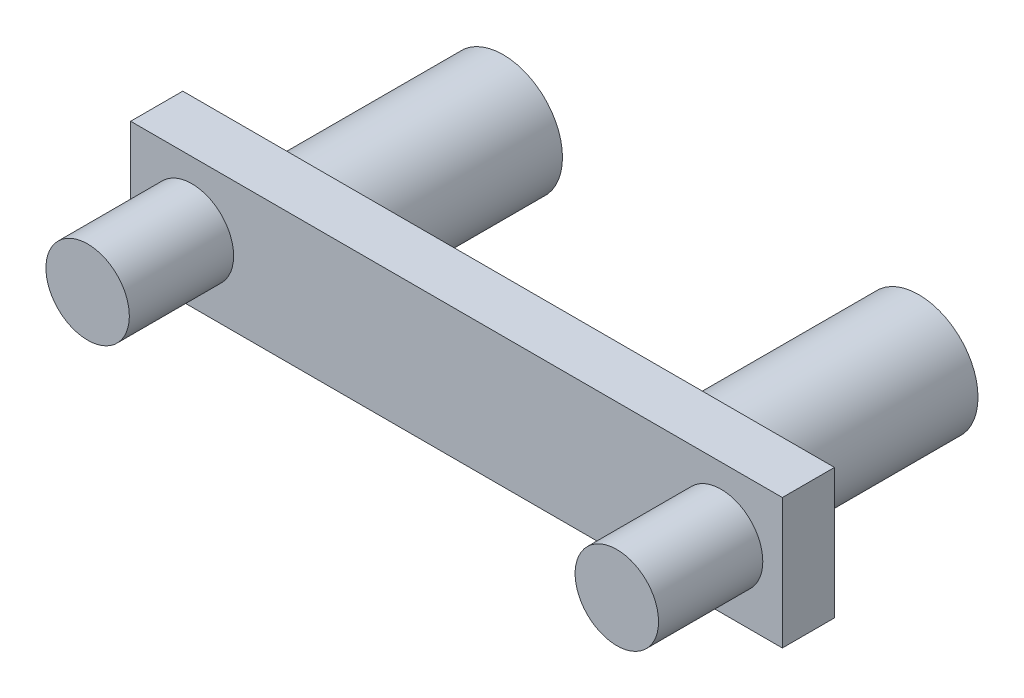
ISO-10303-21;
HEADER;
FILE_DESCRIPTION(('STEP AP214'),'2;1');
FILE_NAME('part.step','',(''),(''),'','','');
FILE_SCHEMA(('AUTOMOTIVE_DESIGN { 1 0 10303 214 1 1 1 1 }'));
ENDSEC;
DATA;
#1=APPLICATION_CONTEXT('core data for automotive mechanical design processes');
#2=APPLICATION_PROTOCOL_DEFINITION('international standard','automotive_design',2000,#1);
#3=PRODUCT_CONTEXT('',#1,'mechanical');
#4=PRODUCT('Part','Part','',(#3));
#5=PRODUCT_RELATED_PRODUCT_CATEGORY('part','',(#4));
#6=PRODUCT_DEFINITION_FORMATION('','',#4);
#7=PRODUCT_DEFINITION_CONTEXT('part definition',#1,'design');
#8=PRODUCT_DEFINITION('design','',#6,#7);
#9=PRODUCT_DEFINITION_SHAPE('','',#8);
#10=(LENGTH_UNIT() NAMED_UNIT(*) SI_UNIT(.MILLI.,.METRE.));
#11=(NAMED_UNIT(*) PLANE_ANGLE_UNIT() SI_UNIT($,.RADIAN.));
#12=(NAMED_UNIT(*) SI_UNIT($,.STERADIAN.) SOLID_ANGLE_UNIT());
#13=UNCERTAINTY_MEASURE_WITH_UNIT(LENGTH_MEASURE(1.E-05),#10,'distance_accuracy_value','');
#14=(GEOMETRIC_REPRESENTATION_CONTEXT(3) GLOBAL_UNCERTAINTY_ASSIGNED_CONTEXT((#13)) GLOBAL_UNIT_ASSIGNED_CONTEXT((#10,
#11,#12)) REPRESENTATION_CONTEXT('',''));
#15=CARTESIAN_POINT('',(0.,0.,0.));
#16=DIRECTION('',(0.,0.,1.));
#17=DIRECTION('',(1.,0.,0.));
#18=AXIS2_PLACEMENT_3D('',#15,#16,#17);
#19=CARTESIAN_POINT('',(0.,5.,2.));
#20=DIRECTION('',(1.,0.,0.));
#21=DIRECTION('',(0.,1.,0.));
#22=AXIS2_PLACEMENT_3D('',#19,#20,#21);
#23=PLANE('',#22);
#24=DIRECTION('',(0.,-1.,0.));
#25=VECTOR('',#24,1.);
#26=CARTESIAN_POINT('',(0.,5.,0.));
#27=LINE('',#26,#25);
#28=CARTESIAN_POINT('',(0.,5.,0.));
#29=VERTEX_POINT('',#28);
#30=CARTESIAN_POINT('',(0.,0.,0.));
#31=VERTEX_POINT('',#30);
#32=EDGE_CURVE('E100',#29,#31,#27,.T.);
#33=ORIENTED_EDGE('',*,*,#32,.T.);
#34=DIRECTION('',(0.,0.,-1.));
#35=VECTOR('',#34,1.);
#36=CARTESIAN_POINT('',(0.,0.,2.));
#37=LINE('',#36,#35);
#38=CARTESIAN_POINT('',(0.,0.,2.));
#39=VERTEX_POINT('',#38);
#40=EDGE_CURVE('E91',#39,#31,#37,.T.);
#41=ORIENTED_EDGE('',*,*,#40,.F.);
#42=DIRECTION('',(0.,-1.,0.));
#43=VECTOR('',#42,1.);
#44=CARTESIAN_POINT('',(0.,5.,2.));
#45=LINE('',#44,#43);
#46=CARTESIAN_POINT('',(0.,5.,2.));
#47=VERTEX_POINT('',#46);
#48=EDGE_CURVE('E85',#47,#39,#45,.T.);
#49=ORIENTED_EDGE('',*,*,#48,.F.);
#50=DIRECTION('',(0.,0.,-1.));
#51=VECTOR('',#50,1.);
#52=CARTESIAN_POINT('',(0.,5.,2.));
#53=LINE('',#52,#51);
#54=EDGE_CURVE('E96',#47,#29,#53,.T.);
#55=ORIENTED_EDGE('',*,*,#54,.T.);
#56=EDGE_LOOP('',(#33,#41,#49,#55));
#57=FACE_BOUND('',#56,.T.);
#58=ADVANCED_FACE('F33',(#57),#23,.F.);
#59=CARTESIAN_POINT('',(0.,0.,2.));
#60=DIRECTION('',(0.,1.,0.));
#61=DIRECTION('',(0.,0.,1.));
#62=AXIS2_PLACEMENT_3D('',#59,#60,#61);
#63=PLANE('',#62);
#64=DIRECTION('',(1.,0.,0.));
#65=VECTOR('',#64,1.);
#66=CARTESIAN_POINT('',(0.,0.,0.));
#67=LINE('',#66,#65);
#68=CARTESIAN_POINT('',(25.,0.,0.));
#69=VERTEX_POINT('',#68);
#70=EDGE_CURVE('E90',#31,#69,#67,.T.);
#71=ORIENTED_EDGE('',*,*,#70,.T.);
#72=DIRECTION('',(0.,0.,-1.));
#73=VECTOR('',#72,1.);
#74=CARTESIAN_POINT('',(25.,0.,2.));
#75=LINE('',#74,#73);
#76=CARTESIAN_POINT('',(25.,0.,2.));
#77=VERTEX_POINT('',#76);
#78=EDGE_CURVE('E88',#77,#69,#75,.T.);
#79=ORIENTED_EDGE('',*,*,#78,.F.);
#80=DIRECTION('',(1.,0.,0.));
#81=VECTOR('',#80,1.);
#82=CARTESIAN_POINT('',(0.,0.,2.));
#83=LINE('',#82,#81);
#84=EDGE_CURVE('E80',#39,#77,#83,.T.);
#85=ORIENTED_EDGE('',*,*,#84,.F.);
#86=ORIENTED_EDGE('',*,*,#40,.T.);
#87=EDGE_LOOP('',(#71,#79,#85,#86));
#88=FACE_BOUND('',#87,.T.);
#89=ADVANCED_FACE('F89',(#88),#63,.F.);
#90=CARTESIAN_POINT('',(25.,0.,2.));
#91=DIRECTION('',(-1.,0.,0.));
#92=DIRECTION('',(0.,0.,1.));
#93=AXIS2_PLACEMENT_3D('',#90,#91,#92);
#94=PLANE('',#93);
#95=DIRECTION('',(0.,1.,0.));
#96=VECTOR('',#95,1.);
#97=CARTESIAN_POINT('',(25.,0.,0.));
#98=LINE('',#97,#96);
#99=CARTESIAN_POINT('',(25.,5.00000000000001,0.));
#100=VERTEX_POINT('',#99);
#101=EDGE_CURVE('E66',#69,#100,#98,.T.);
#102=ORIENTED_EDGE('',*,*,#101,.T.);
#103=DIRECTION('',(0.,0.,-1.));
#104=VECTOR('',#103,1.);
#105=CARTESIAN_POINT('',(25.,5.00000000000001,2.));
#106=LINE('',#105,#104);
#107=CARTESIAN_POINT('',(25.,5.00000000000001,2.));
#108=VERTEX_POINT('',#107);
#109=EDGE_CURVE('E92',#108,#100,#106,.T.);
#110=ORIENTED_EDGE('',*,*,#109,.F.);
#111=DIRECTION('',(0.,1.,0.));
#112=VECTOR('',#111,1.);
#113=CARTESIAN_POINT('',(25.,0.,2.));
#114=LINE('',#113,#112);
#115=EDGE_CURVE('E83',#77,#108,#114,.T.);
#116=ORIENTED_EDGE('',*,*,#115,.F.);
#117=ORIENTED_EDGE('',*,*,#78,.T.);
#118=EDGE_LOOP('',(#102,#110,#116,#117));
#119=FACE_BOUND('',#118,.T.);
#120=ADVANCED_FACE('F94',(#119),#94,.F.);
#121=CARTESIAN_POINT('',(25.,5.00000000000001,2.));
#122=DIRECTION('',(0.,-1.,0.));
#123=DIRECTION('',(1.,0.,0.));
#124=AXIS2_PLACEMENT_3D('',#121,#122,#123);
#125=PLANE('',#124);
#126=DIRECTION('',(-1.,0.,0.));
#127=VECTOR('',#126,1.);
#128=CARTESIAN_POINT('',(25.,5.00000000000001,0.));
#129=LINE('',#128,#127);
#130=EDGE_CURVE('E72',#100,#29,#129,.T.);
#131=ORIENTED_EDGE('',*,*,#130,.T.);
#132=ORIENTED_EDGE('',*,*,#54,.F.);
#133=DIRECTION('',(-1.,0.,0.));
#134=VECTOR('',#133,1.);
#135=CARTESIAN_POINT('',(25.,5.00000000000001,2.));
#136=LINE('',#135,#134);
#137=EDGE_CURVE('E49',#108,#47,#136,.T.);
#138=ORIENTED_EDGE('',*,*,#137,.F.);
#139=ORIENTED_EDGE('',*,*,#109,.T.);
#140=EDGE_LOOP('',(#131,#132,#138,#139));
#141=FACE_BOUND('',#140,.T.);
#142=ADVANCED_FACE('F124',(#141),#125,.F.);
#143=CARTESIAN_POINT('',(0.,0.,2.));
#144=DIRECTION('',(0.,0.,1.));
#145=DIRECTION('',(1.,0.,0.));
#146=AXIS2_PLACEMENT_3D('',#143,#144,#145);
#147=PLANE('',#146);
#148=CARTESIAN_POINT('',(22.65,2.5,2.));
#149=DIRECTION('',(0.,0.,1.));
#150=DIRECTION('',(1.,0.,0.));
#151=AXIS2_PLACEMENT_3D('',#148,#149,#150);
#152=CIRCLE('',#151,1.6);
#153=CARTESIAN_POINT('',(24.25,2.5,2.));
#154=VERTEX_POINT('',#153);
#155=EDGE_CURVE('E299',#154,#154,#152,.T.);
#156=ORIENTED_EDGE('',*,*,#155,.F.);
#157=EDGE_LOOP('',(#156));
#158=FACE_BOUND('',#157,.T.);
#159=CARTESIAN_POINT('',(2.35,2.5,2.));
#160=DIRECTION('',(0.,0.,1.));
#161=DIRECTION('',(1.,0.,0.));
#162=AXIS2_PLACEMENT_3D('',#159,#160,#161);
#163=CIRCLE('',#162,1.6);
#164=CARTESIAN_POINT('',(3.95,2.5,2.));
#165=VERTEX_POINT('',#164);
#166=EDGE_CURVE('E303',#165,#165,#163,.T.);
#167=ORIENTED_EDGE('',*,*,#166,.F.);
#168=EDGE_LOOP('',(#167));
#169=FACE_BOUND('',#168,.T.);
#170=ORIENTED_EDGE('',*,*,#48,.T.);
#171=ORIENTED_EDGE('',*,*,#84,.T.);
#172=ORIENTED_EDGE('',*,*,#115,.T.);
#173=ORIENTED_EDGE('',*,*,#137,.T.);
#174=EDGE_LOOP('',(#170,#171,#172,#173));
#175=FACE_BOUND('',#174,.T.);
#176=ADVANCED_FACE('F81',(#158,#169,#175),#147,.T.);
#177=CARTESIAN_POINT('',(0.,0.,0.));
#178=DIRECTION('',(0.,0.,1.));
#179=DIRECTION('',(1.,0.,0.));
#180=AXIS2_PLACEMENT_3D('',#177,#178,#179);
#181=PLANE('',#180);
#182=CARTESIAN_POINT('',(4.53,2.32297448506102,0.));
#183=DIRECTION('',(0.,0.,1.));
#184=DIRECTION('',(1.,0.,0.));
#185=AXIS2_PLACEMENT_3D('',#182,#183,#184);
#186=CIRCLE('',#185,2.275);
#187=CARTESIAN_POINT('',(6.805,2.32297448506102,0.));
#188=VERTEX_POINT('',#187);
#189=EDGE_CURVE('E11',#188,#188,#186,.F.);
#190=ORIENTED_EDGE('',*,*,#189,.F.);
#191=EDGE_LOOP('',(#190));
#192=FACE_BOUND('',#191,.T.);
#193=CARTESIAN_POINT('',(20.47,2.32297448506102,0.));
#194=DIRECTION('',(0.,0.,1.));
#195=DIRECTION('',(1.,0.,0.));
#196=AXIS2_PLACEMENT_3D('',#193,#194,#195);
#197=CIRCLE('',#196,2.275);
#198=CARTESIAN_POINT('',(22.745,2.32297448506102,0.));
#199=VERTEX_POINT('',#198);
#200=EDGE_CURVE('E41',#199,#199,#197,.F.);
#201=ORIENTED_EDGE('',*,*,#200,.F.);
#202=EDGE_LOOP('',(#201));
#203=FACE_BOUND('',#202,.T.);
#204=ORIENTED_EDGE('',*,*,#32,.F.);
#205=ORIENTED_EDGE('',*,*,#130,.F.);
#206=ORIENTED_EDGE('',*,*,#101,.F.);
#207=ORIENTED_EDGE('',*,*,#70,.F.);
#208=EDGE_LOOP('',(#204,#205,#206,#207));
#209=FACE_BOUND('',#208,.T.);
#210=ADVANCED_FACE('F114',(#192,#203,#209),#181,.F.);
#211=CARTESIAN_POINT('',(2.35,2.5,6.));
#212=DIRECTION('',(0.,0.,-1.));
#213=DIRECTION('',(-1.,0.,0.));
#214=AXIS2_PLACEMENT_3D('',#211,#212,#213);
#215=CYLINDRICAL_SURFACE('',#214,1.6);
#216=CARTESIAN_POINT('',(2.35,2.5,6.));
#217=DIRECTION('',(0.,0.,1.));
#218=DIRECTION('',(1.,0.,0.));
#219=AXIS2_PLACEMENT_3D('',#216,#217,#218);
#220=CIRCLE('',#219,1.6);
#221=CARTESIAN_POINT('',(3.95,2.5,6.));
#222=VERTEX_POINT('',#221);
#223=EDGE_CURVE('E103',#222,#222,#220,.T.);
#224=ORIENTED_EDGE('',*,*,#223,.F.);
#225=EDGE_LOOP('',(#224));
#226=FACE_BOUND('',#225,.T.);
#227=ORIENTED_EDGE('',*,*,#166,.T.);
#228=EDGE_LOOP('',(#227));
#229=FACE_BOUND('',#228,.T.);
#230=ADVANCED_FACE('F117',(#226,#229),#215,.T.);
#231=CARTESIAN_POINT('',(2.35,2.5,6.));
#232=DIRECTION('',(0.,0.,1.));
#233=DIRECTION('',(1.,0.,0.));
#234=AXIS2_PLACEMENT_3D('',#231,#232,#233);
#235=PLANE('',#234);
#236=ORIENTED_EDGE('',*,*,#223,.T.);
#237=EDGE_LOOP('',(#236));
#238=FACE_BOUND('',#237,.T.);
#239=ADVANCED_FACE('F164',(#238),#235,.T.);
#240=CARTESIAN_POINT('',(22.65,2.5,6.));
#241=DIRECTION('',(0.,0.,-1.));
#242=DIRECTION('',(-1.,0.,0.));
#243=AXIS2_PLACEMENT_3D('',#240,#241,#242);
#244=CYLINDRICAL_SURFACE('',#243,1.6);
#245=CARTESIAN_POINT('',(22.65,2.5,6.));
#246=DIRECTION('',(0.,0.,1.));
#247=DIRECTION('',(1.,0.,0.));
#248=AXIS2_PLACEMENT_3D('',#245,#246,#247);
#249=CIRCLE('',#248,1.6);
#250=CARTESIAN_POINT('',(24.25,2.5,6.));
#251=VERTEX_POINT('',#250);
#252=EDGE_CURVE('E300',#251,#251,#249,.T.);
#253=ORIENTED_EDGE('',*,*,#252,.F.);
#254=EDGE_LOOP('',(#253));
#255=FACE_BOUND('',#254,.T.);
#256=ORIENTED_EDGE('',*,*,#155,.T.);
#257=EDGE_LOOP('',(#256));
#258=FACE_BOUND('',#257,.T.);
#259=ADVANCED_FACE('F174',(#255,#258),#244,.T.);
#260=CARTESIAN_POINT('',(22.65,2.5,6.));
#261=DIRECTION('',(0.,0.,1.));
#262=DIRECTION('',(1.,0.,0.));
#263=AXIS2_PLACEMENT_3D('',#260,#261,#262);
#264=PLANE('',#263);
#265=ORIENTED_EDGE('',*,*,#252,.T.);
#266=EDGE_LOOP('',(#265));
#267=FACE_BOUND('',#266,.T.);
#268=ADVANCED_FACE('F184',(#267),#264,.T.);
#269=CARTESIAN_POINT('',(20.47,2.32297448506102,-7.76));
#270=DIRECTION('',(0.,0.,-1.));
#271=DIRECTION('',(-1.,0.,0.));
#272=AXIS2_PLACEMENT_3D('',#269,#270,#271);
#273=PLANE('',#272);
#274=CARTESIAN_POINT('',(20.47,2.32297448506102,-7.76));
#275=DIRECTION('',(0.,0.,-1.));
#276=DIRECTION('',(-1.,0.,0.));
#277=AXIS2_PLACEMENT_3D('',#274,#275,#276);
#278=CIRCLE('',#277,2.275);
#279=CARTESIAN_POINT('',(18.195,2.32297448506102,-7.76));
#280=VERTEX_POINT('',#279);
#281=EDGE_CURVE('E294',#280,#280,#278,.T.);
#282=ORIENTED_EDGE('',*,*,#281,.T.);
#283=EDGE_LOOP('',(#282));
#284=FACE_BOUND('',#283,.T.);
#285=CARTESIAN_POINT('',(20.47,2.32297448506102,-7.76));
#286=DIRECTION('',(0.,0.,-1.));
#287=DIRECTION('',(-1.,0.,0.));
#288=AXIS2_PLACEMENT_3D('',#285,#286,#287);
#289=CIRCLE('',#288,1.6);
#290=CARTESIAN_POINT('',(18.87,2.32297448506102,-7.76));
#291=VERTEX_POINT('',#290);
#292=EDGE_CURVE('E291',#291,#291,#289,.T.);
#293=ORIENTED_EDGE('',*,*,#292,.F.);
#294=EDGE_LOOP('',(#293));
#295=FACE_BOUND('',#294,.T.);
#296=ADVANCED_FACE('F194',(#284,#295),#273,.T.);
#297=CARTESIAN_POINT('',(20.47,2.32297448506102,-7.76));
#298=DIRECTION('',(0.,0.,1.));
#299=DIRECTION('',(1.,0.,0.));
#300=AXIS2_PLACEMENT_3D('',#297,#298,#299);
#301=CYLINDRICAL_SURFACE('',#300,2.275);
#302=ORIENTED_EDGE('',*,*,#281,.F.);
#303=EDGE_LOOP('',(#302));
#304=FACE_BOUND('',#303,.T.);
#305=ORIENTED_EDGE('',*,*,#200,.T.);
#306=EDGE_LOOP('',(#305));
#307=FACE_BOUND('',#306,.T.);
#308=ADVANCED_FACE('F112',(#304,#307),#301,.T.);
#309=CARTESIAN_POINT('',(20.47,2.32297448506102,-7.76));
#310=DIRECTION('',(0.,0.,1.));
#311=DIRECTION('',(1.,0.,0.));
#312=AXIS2_PLACEMENT_3D('',#309,#310,#311);
#313=CYLINDRICAL_SURFACE('',#312,1.6);
#314=ORIENTED_EDGE('',*,*,#292,.T.);
#315=EDGE_LOOP('',(#314));
#316=FACE_BOUND('',#315,.T.);
#317=CARTESIAN_POINT('',(20.47,2.32297448506102,0.));
#318=DIRECTION('',(0.,0.,-1.));
#319=DIRECTION('',(-1.,0.,0.));
#320=AXIS2_PLACEMENT_3D('',#317,#318,#319);
#321=CIRCLE('',#320,1.6);
#322=CARTESIAN_POINT('',(18.87,2.32297448506102,0.));
#323=VERTEX_POINT('',#322);
#324=EDGE_CURVE('E290',#323,#323,#321,.T.);
#325=ORIENTED_EDGE('',*,*,#324,.F.);
#326=EDGE_LOOP('',(#325));
#327=FACE_BOUND('',#326,.T.);
#328=ADVANCED_FACE('F220',(#316,#327),#313,.F.);
#329=ORIENTED_EDGE('',*,*,#324,.T.);
#330=EDGE_LOOP('',(#329));
#331=FACE_BOUND('',#330,.T.);
#332=ADVANCED_FACE('F121',(#331),#181,.F.);
#333=CARTESIAN_POINT('',(4.53,2.32297448506102,-7.76));
#334=DIRECTION('',(0.,0.,-1.));
#335=DIRECTION('',(-1.,0.,0.));
#336=AXIS2_PLACEMENT_3D('',#333,#334,#335);
#337=PLANE('',#336);
#338=CARTESIAN_POINT('',(4.53,2.32297448506102,-7.76));
#339=DIRECTION('',(0.,0.,-1.));
#340=DIRECTION('',(-1.,0.,0.));
#341=AXIS2_PLACEMENT_3D('',#338,#339,#340);
#342=CIRCLE('',#341,2.275);
#343=CARTESIAN_POINT('',(2.255,2.32297448506102,-7.76));
#344=VERTEX_POINT('',#343);
#345=EDGE_CURVE('E285',#344,#344,#342,.T.);
#346=ORIENTED_EDGE('',*,*,#345,.T.);
#347=EDGE_LOOP('',(#346));
#348=FACE_BOUND('',#347,.T.);
#349=CARTESIAN_POINT('',(4.53,2.32297448506102,-7.76));
#350=DIRECTION('',(0.,0.,-1.));
#351=DIRECTION('',(-1.,0.,0.));
#352=AXIS2_PLACEMENT_3D('',#349,#350,#351);
#353=CIRCLE('',#352,1.6);
#354=CARTESIAN_POINT('',(2.93,2.32297448506102,-7.76));
#355=VERTEX_POINT('',#354);
#356=EDGE_CURVE('E282',#355,#355,#353,.T.);
#357=ORIENTED_EDGE('',*,*,#356,.F.);
#358=EDGE_LOOP('',(#357));
#359=FACE_BOUND('',#358,.T.);
#360=ADVANCED_FACE('F239',(#348,#359),#337,.T.);
#361=CARTESIAN_POINT('',(4.53,2.32297448506102,-7.76));
#362=DIRECTION('',(0.,0.,1.));
#363=DIRECTION('',(1.,0.,0.));
#364=AXIS2_PLACEMENT_3D('',#361,#362,#363);
#365=CYLINDRICAL_SURFACE('',#364,2.275);
#366=ORIENTED_EDGE('',*,*,#345,.F.);
#367=EDGE_LOOP('',(#366));
#368=FACE_BOUND('',#367,.T.);
#369=ORIENTED_EDGE('',*,*,#189,.T.);
#370=EDGE_LOOP('',(#369));
#371=FACE_BOUND('',#370,.T.);
#372=ADVANCED_FACE('F247',(#368,#371),#365,.T.);
#373=CARTESIAN_POINT('',(4.53,2.32297448506102,-7.76));
#374=DIRECTION('',(0.,0.,1.));
#375=DIRECTION('',(1.,0.,0.));
#376=AXIS2_PLACEMENT_3D('',#373,#374,#375);
#377=CYLINDRICAL_SURFACE('',#376,1.6);
#378=ORIENTED_EDGE('',*,*,#356,.T.);
#379=EDGE_LOOP('',(#378));
#380=FACE_BOUND('',#379,.T.);
#381=CARTESIAN_POINT('',(4.53,2.32297448506102,0.));
#382=DIRECTION('',(0.,0.,-1.));
#383=DIRECTION('',(-1.,0.,0.));
#384=AXIS2_PLACEMENT_3D('',#381,#382,#383);
#385=CIRCLE('',#384,1.6);
#386=CARTESIAN_POINT('',(2.93,2.32297448506102,0.));
#387=VERTEX_POINT('',#386);
#388=EDGE_CURVE('E280',#387,#387,#385,.T.);
#389=ORIENTED_EDGE('',*,*,#388,.F.);
#390=EDGE_LOOP('',(#389));
#391=FACE_BOUND('',#390,.T.);
#392=ADVANCED_FACE('F257',(#380,#391),#377,.F.);
#393=ORIENTED_EDGE('',*,*,#388,.T.);
#394=EDGE_LOOP('',(#393));
#395=FACE_BOUND('',#394,.T.);
#396=ADVANCED_FACE('F120',(#395),#181,.F.);
#397=CLOSED_SHELL('',(#58,#89,#120,#142,#176,#210,#230,#239,#259,#268,#296,#308,#328,#332,#360,
#372,#392,#396));
#398=MANIFOLD_SOLID_BREP('B2',#397);
#399=ADVANCED_BREP_SHAPE_REPRESENTATION('',(#18,#398),#14);
#400=SHAPE_DEFINITION_REPRESENTATION(#9,#399);
ENDSEC;
END-ISO-10303-21;
